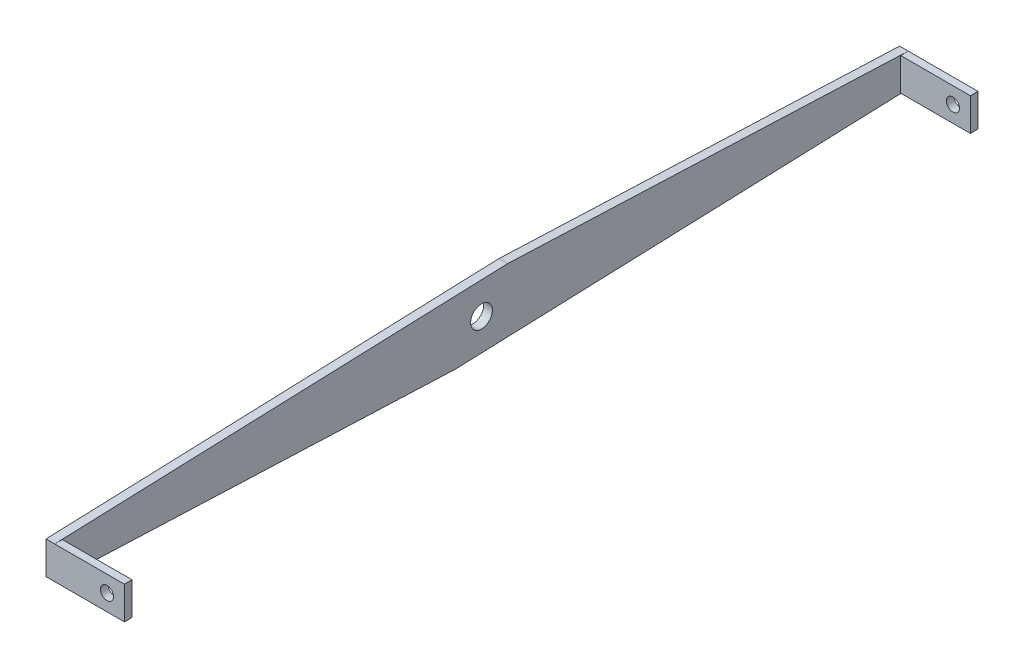
ISO-10303-21;
HEADER;
FILE_DESCRIPTION(('STEP AP214'),'2;1');
FILE_NAME('part.step','',(''),(''),'','','');
FILE_SCHEMA(('AUTOMOTIVE_DESIGN { 1 0 10303 214 1 1 1 1 }'));
ENDSEC;
DATA;
#1=APPLICATION_CONTEXT('core data for automotive mechanical design processes');
#2=APPLICATION_PROTOCOL_DEFINITION('international standard','automotive_design',2000,#1);
#3=PRODUCT_CONTEXT('',#1,'mechanical');
#4=PRODUCT('Part','Part','',(#3));
#5=PRODUCT_RELATED_PRODUCT_CATEGORY('part','',(#4));
#6=PRODUCT_DEFINITION_FORMATION('','',#4);
#7=PRODUCT_DEFINITION_CONTEXT('part definition',#1,'design');
#8=PRODUCT_DEFINITION('design','',#6,#7);
#9=PRODUCT_DEFINITION_SHAPE('','',#8);
#10=(LENGTH_UNIT() NAMED_UNIT(*) SI_UNIT(.MILLI.,.METRE.));
#11=(NAMED_UNIT(*) PLANE_ANGLE_UNIT() SI_UNIT($,.RADIAN.));
#12=(NAMED_UNIT(*) SI_UNIT($,.STERADIAN.) SOLID_ANGLE_UNIT());
#13=UNCERTAINTY_MEASURE_WITH_UNIT(LENGTH_MEASURE(1.E-05),#10,'distance_accuracy_value','');
#14=(GEOMETRIC_REPRESENTATION_CONTEXT(3) GLOBAL_UNCERTAINTY_ASSIGNED_CONTEXT((#13)) GLOBAL_UNIT_ASSIGNED_CONTEXT((#10,
#11,#12)) REPRESENTATION_CONTEXT('',''));
#15=CARTESIAN_POINT('',(0.,0.,0.));
#16=DIRECTION('',(0.,0.,1.));
#17=DIRECTION('',(1.,0.,0.));
#18=AXIS2_PLACEMENT_3D('',#15,#16,#17);
#19=CARTESIAN_POINT('',(2.,0.,0.));
#20=DIRECTION('',(1.,0.,0.));
#21=DIRECTION('',(0.,0.,-1.));
#22=AXIS2_PLACEMENT_3D('',#19,#20,#21);
#23=PLANE('',#22);
#24=CARTESIAN_POINT('',(2.,-7.5,-196.));
#25=DIRECTION('',(1.,0.,0.));
#26=DIRECTION('',(0.,0.,-1.));
#27=AXIS2_PLACEMENT_3D('',#24,#25,#26);
#28=CIRCLE('',#27,4.99999999999999);
#29=CARTESIAN_POINT('',(2.,-7.5,-201.));
#30=VERTEX_POINT('',#29);
#31=EDGE_CURVE('E253',#30,#30,#28,.T.);
#32=ORIENTED_EDGE('',*,*,#31,.F.);
#33=EDGE_LOOP('',(#32));
#34=FACE_BOUND('',#33,.T.);
#35=DIRECTION('',(0.,-1.,0.));
#36=VECTOR('',#35,1.);
#37=CARTESIAN_POINT('',(2.,-15.,-388.5));
#38=LINE('',#37,#36);
#39=CARTESIAN_POINT('',(2.,0.,-388.5));
#40=VERTEX_POINT('',#39);
#41=CARTESIAN_POINT('',(2.,-15.,-388.5));
#42=VERTEX_POINT('',#41);
#43=EDGE_CURVE('E237',#40,#42,#38,.T.);
#44=ORIENTED_EDGE('',*,*,#43,.F.);
#45=DIRECTION('',(0.,0.,1.));
#46=VECTOR('',#45,1.);
#47=CARTESIAN_POINT('',(2.,0.,-392.));
#48=LINE('',#47,#46);
#49=CARTESIAN_POINT('',(2.,0.,-392.));
#50=VERTEX_POINT('',#49);
#51=EDGE_CURVE('E235',#50,#40,#48,.T.);
#52=ORIENTED_EDGE('',*,*,#51,.F.);
#53=DIRECTION('',(0.,0.0407270506581183,0.999170309479165));
#54=VECTOR('',#53,1.);
#55=CARTESIAN_POINT('',(2.,7.50000000000003,-208.));
#56=LINE('',#55,#54);
#57=CARTESIAN_POINT('',(2.,7.50000000000003,-208.));
#58=VERTEX_POINT('',#57);
#59=EDGE_CURVE('E189',#50,#58,#56,.T.);
#60=ORIENTED_EDGE('',*,*,#59,.T.);
#61=DIRECTION('',(0.,-0.0360342748063684,0.999350554629945));
#62=VECTOR('',#61,1.);
#63=CARTESIAN_POINT('',(2.,0.,0.));
#64=LINE('',#63,#62);
#65=CARTESIAN_POINT('',(2.,0.,0.));
#66=VERTEX_POINT('',#65);
#67=EDGE_CURVE('E191',#58,#66,#64,.T.);
#68=ORIENTED_EDGE('',*,*,#67,.T.);
#69=DIRECTION('',(0.,0.,1.));
#70=VECTOR('',#69,1.);
#71=CARTESIAN_POINT('',(2.,0.,0.));
#72=LINE('',#71,#70);
#73=CARTESIAN_POINT('',(2.,0.,-3.5));
#74=VERTEX_POINT('',#73);
#75=EDGE_CURVE('E59',#74,#66,#72,.T.);
#76=ORIENTED_EDGE('',*,*,#75,.F.);
#77=DIRECTION('',(0.,1.,0.));
#78=VECTOR('',#77,1.);
#79=CARTESIAN_POINT('',(2.,0.,-3.5));
#80=LINE('',#79,#78);
#81=CARTESIAN_POINT('',(2.,-15.,-3.5));
#82=VERTEX_POINT('',#81);
#83=EDGE_CURVE('E154',#82,#74,#80,.T.);
#84=ORIENTED_EDGE('',*,*,#83,.F.);
#85=DIRECTION('',(0.,0.,-1.));
#86=VECTOR('',#85,1.);
#87=CARTESIAN_POINT('',(2.,-15.,0.));
#88=LINE('',#87,#86);
#89=CARTESIAN_POINT('',(2.,-15.,0.));
#90=VERTEX_POINT('',#89);
#91=EDGE_CURVE('E151',#90,#82,#88,.T.);
#92=ORIENTED_EDGE('',*,*,#91,.F.);
#93=DIRECTION('',(0.,-0.0407270506581183,-0.999170309479165));
#94=VECTOR('',#93,1.);
#95=CARTESIAN_POINT('',(2.,-15.,0.));
#96=LINE('',#95,#94);
#97=CARTESIAN_POINT('',(2.,-22.5,-184.));
#98=VERTEX_POINT('',#97);
#99=EDGE_CURVE('E183',#90,#98,#96,.T.);
#100=ORIENTED_EDGE('',*,*,#99,.T.);
#101=DIRECTION('',(0.,0.0360342748063683,-0.999350554629945));
#102=VECTOR('',#101,1.);
#103=CARTESIAN_POINT('',(2.,-22.5,-184.));
#104=LINE('',#103,#102);
#105=CARTESIAN_POINT('',(2.,-15.,-392.));
#106=VERTEX_POINT('',#105);
#107=EDGE_CURVE('E185',#98,#106,#104,.T.);
#108=ORIENTED_EDGE('',*,*,#107,.T.);
#109=DIRECTION('',(0.,0.,-1.));
#110=VECTOR('',#109,1.);
#111=CARTESIAN_POINT('',(2.,-15.,-392.));
#112=LINE('',#111,#110);
#113=EDGE_CURVE('E144',#42,#106,#112,.T.);
#114=ORIENTED_EDGE('',*,*,#113,.F.);
#115=EDGE_LOOP('',(#44,#52,#60,#68,#76,#84,#92,#100,#108,#114));
#116=FACE_BOUND('',#115,.T.);
#117=ADVANCED_FACE('F35',(#34,#116),#23,.T.);
#118=CARTESIAN_POINT('',(2.,0.,0.));
#119=DIRECTION('',(0.,0.,-1.));
#120=DIRECTION('',(-1.,0.,0.));
#121=AXIS2_PLACEMENT_3D('',#118,#119,#120);
#122=PLANE('',#121);
#123=CARTESIAN_POINT('',(26.0000000000002,-7.5,0.));
#124=DIRECTION('',(0.,0.,1.));
#125=DIRECTION('',(1.,0.,0.));
#126=AXIS2_PLACEMENT_3D('',#123,#124,#125);
#127=CIRCLE('',#126,3.00000000000001);
#128=CARTESIAN_POINT('',(29.0000000000002,-7.5,0.));
#129=VERTEX_POINT('',#128);
#130=EDGE_CURVE('E249',#129,#129,#127,.T.);
#131=ORIENTED_EDGE('',*,*,#130,.F.);
#132=EDGE_LOOP('',(#131));
#133=FACE_BOUND('',#132,.T.);
#134=DIRECTION('',(0.,-1.,0.));
#135=VECTOR('',#134,1.);
#136=CARTESIAN_POINT('',(-2.,0.,0.));
#137=LINE('',#136,#135);
#138=CARTESIAN_POINT('',(-2.,0.,0.));
#139=VERTEX_POINT('',#138);
#140=CARTESIAN_POINT('',(-2.,-15.,0.));
#141=VERTEX_POINT('',#140);
#142=EDGE_CURVE('E182',#139,#141,#137,.T.);
#143=ORIENTED_EDGE('',*,*,#142,.T.);
#144=DIRECTION('',(-1.,0.,0.));
#145=VECTOR('',#144,1.);
#146=CARTESIAN_POINT('',(2.,-15.,0.));
#147=LINE('',#146,#145);
#148=EDGE_CURVE('E11',#90,#141,#147,.T.);
#149=ORIENTED_EDGE('',*,*,#148,.F.);
#150=DIRECTION('',(-1.,0.,0.));
#151=VECTOR('',#150,1.);
#152=CARTESIAN_POINT('',(34.,-15.,0.));
#153=LINE('',#152,#151);
#154=CARTESIAN_POINT('',(34.,-15.,0.));
#155=VERTEX_POINT('',#154);
#156=EDGE_CURVE('E179',#155,#90,#153,.T.);
#157=ORIENTED_EDGE('',*,*,#156,.F.);
#158=DIRECTION('',(0.,-1.,0.));
#159=VECTOR('',#158,1.);
#160=CARTESIAN_POINT('',(34.,0.,0.));
#161=LINE('',#160,#159);
#162=CARTESIAN_POINT('',(34.,0.,0.));
#163=VERTEX_POINT('',#162);
#164=EDGE_CURVE('E159',#163,#155,#161,.T.);
#165=ORIENTED_EDGE('',*,*,#164,.F.);
#166=DIRECTION('',(-1.,0.,0.));
#167=VECTOR('',#166,1.);
#168=CARTESIAN_POINT('',(34.,0.,0.));
#169=LINE('',#168,#167);
#170=EDGE_CURVE('E167',#163,#66,#169,.T.);
#171=ORIENTED_EDGE('',*,*,#170,.T.);
#172=DIRECTION('',(-1.,0.,0.));
#173=VECTOR('',#172,1.);
#174=CARTESIAN_POINT('',(2.,0.,0.));
#175=LINE('',#174,#173);
#176=EDGE_CURVE('E193',#66,#139,#175,.T.);
#177=ORIENTED_EDGE('',*,*,#176,.T.);
#178=EDGE_LOOP('',(#143,#149,#157,#165,#171,#177));
#179=FACE_BOUND('',#178,.T.);
#180=ADVANCED_FACE('F37',(#133,#179),#122,.F.);
#181=CARTESIAN_POINT('',(2.,-15.,0.));
#182=DIRECTION('',(0.,0.999170309479165,-0.0407270506581183));
#183=DIRECTION('',(0.,0.0407270506581183,0.999170309479166));
#184=AXIS2_PLACEMENT_3D('',#181,#182,#183);
#185=PLANE('',#184);
#186=DIRECTION('',(0.,-0.0407270506581183,-0.999170309479165));
#187=VECTOR('',#186,1.);
#188=CARTESIAN_POINT('',(-2.,-15.,0.));
#189=LINE('',#188,#187);
#190=CARTESIAN_POINT('',(-2.,-22.5,-184.));
#191=VERTEX_POINT('',#190);
#192=EDGE_CURVE('E196',#141,#191,#189,.T.);
#193=ORIENTED_EDGE('',*,*,#192,.T.);
#194=DIRECTION('',(-1.,0.,0.));
#195=VECTOR('',#194,1.);
#196=CARTESIAN_POINT('',(2.,-22.5,-184.));
#197=LINE('',#196,#195);
#198=EDGE_CURVE('E44',#98,#191,#197,.T.);
#199=ORIENTED_EDGE('',*,*,#198,.F.);
#200=ORIENTED_EDGE('',*,*,#99,.F.);
#201=ORIENTED_EDGE('',*,*,#148,.T.);
#202=EDGE_LOOP('',(#193,#199,#200,#201));
#203=FACE_BOUND('',#202,.T.);
#204=ADVANCED_FACE('F283',(#203),#185,.F.);
#205=CARTESIAN_POINT('',(2.,-22.5,-184.));
#206=DIRECTION('',(0.,0.999350554629945,0.0360342748063683));
#207=DIRECTION('',(0.,-0.0360342748063683,0.999350554629945));
#208=AXIS2_PLACEMENT_3D('',#205,#206,#207);
#209=PLANE('',#208);
#210=DIRECTION('',(0.,0.0360342748063683,-0.999350554629945));
#211=VECTOR('',#210,1.);
#212=CARTESIAN_POINT('',(-2.,-22.5,-184.));
#213=LINE('',#212,#211);
#214=CARTESIAN_POINT('',(-2.,-15.,-392.));
#215=VERTEX_POINT('',#214);
#216=EDGE_CURVE('E198',#191,#215,#213,.T.);
#217=ORIENTED_EDGE('',*,*,#216,.T.);
#218=DIRECTION('',(-1.,0.,0.));
#219=VECTOR('',#218,1.);
#220=CARTESIAN_POINT('',(2.,-15.,-392.));
#221=LINE('',#220,#219);
#222=EDGE_CURVE('E211',#106,#215,#221,.T.);
#223=ORIENTED_EDGE('',*,*,#222,.F.);
#224=ORIENTED_EDGE('',*,*,#107,.F.);
#225=ORIENTED_EDGE('',*,*,#198,.T.);
#226=EDGE_LOOP('',(#217,#223,#224,#225));
#227=FACE_BOUND('',#226,.T.);
#228=ADVANCED_FACE('F219',(#227),#209,.F.);
#229=CARTESIAN_POINT('',(2.,0.,-392.));
#230=DIRECTION('',(0.,0.,1.));
#231=DIRECTION('',(1.,0.,0.));
#232=AXIS2_PLACEMENT_3D('',#229,#230,#231);
#233=PLANE('',#232);
#234=CARTESIAN_POINT('',(26.0000000000002,-7.5,-392.));
#235=DIRECTION('',(0.,0.,1.));
#236=DIRECTION('',(1.,0.,0.));
#237=AXIS2_PLACEMENT_3D('',#234,#235,#236);
#238=CIRCLE('',#237,3.00000000000001);
#239=CARTESIAN_POINT('',(29.0000000000002,-7.5,-392.));
#240=VERTEX_POINT('',#239);
#241=EDGE_CURVE('E252',#240,#240,#238,.T.);
#242=ORIENTED_EDGE('',*,*,#241,.T.);
#243=EDGE_LOOP('',(#242));
#244=FACE_BOUND('',#243,.T.);
#245=DIRECTION('',(0.,1.,0.));
#246=VECTOR('',#245,1.);
#247=CARTESIAN_POINT('',(-2.,0.,-392.));
#248=LINE('',#247,#246);
#249=CARTESIAN_POINT('',(-2.,0.,-392.));
#250=VERTEX_POINT('',#249);
#251=EDGE_CURVE('E200',#215,#250,#248,.T.);
#252=ORIENTED_EDGE('',*,*,#251,.T.);
#253=DIRECTION('',(-1.,0.,0.));
#254=VECTOR('',#253,1.);
#255=CARTESIAN_POINT('',(2.,0.,-392.));
#256=LINE('',#255,#254);
#257=EDGE_CURVE('E149',#50,#250,#256,.T.);
#258=ORIENTED_EDGE('',*,*,#257,.F.);
#259=DIRECTION('',(-1.,0.,0.));
#260=VECTOR('',#259,1.);
#261=CARTESIAN_POINT('',(34.,0.,-392.));
#262=LINE('',#261,#260);
#263=CARTESIAN_POINT('',(34.,0.,-392.));
#264=VERTEX_POINT('',#263);
#265=EDGE_CURVE('E129',#264,#50,#262,.T.);
#266=ORIENTED_EDGE('',*,*,#265,.F.);
#267=DIRECTION('',(0.,1.,0.));
#268=VECTOR('',#267,1.);
#269=CARTESIAN_POINT('',(34.,-15.,-392.));
#270=LINE('',#269,#268);
#271=CARTESIAN_POINT('',(34.,-15.,-392.));
#272=VERTEX_POINT('',#271);
#273=EDGE_CURVE('E136',#272,#264,#270,.T.);
#274=ORIENTED_EDGE('',*,*,#273,.F.);
#275=DIRECTION('',(-1.,0.,0.));
#276=VECTOR('',#275,1.);
#277=CARTESIAN_POINT('',(34.,-15.,-392.));
#278=LINE('',#277,#276);
#279=EDGE_CURVE('E247',#272,#106,#278,.T.);
#280=ORIENTED_EDGE('',*,*,#279,.T.);
#281=ORIENTED_EDGE('',*,*,#222,.T.);
#282=EDGE_LOOP('',(#252,#258,#266,#274,#280,#281));
#283=FACE_BOUND('',#282,.T.);
#284=ADVANCED_FACE('F147',(#244,#283),#233,.F.);
#285=CARTESIAN_POINT('',(2.,7.50000000000003,-208.));
#286=DIRECTION('',(0.,-0.999170309479165,0.0407270506581183));
#287=DIRECTION('',(0.,-0.0407270506581183,-0.999170309479166));
#288=AXIS2_PLACEMENT_3D('',#285,#286,#287);
#289=PLANE('',#288);
#290=DIRECTION('',(0.,0.0407270506581183,0.999170309479165));
#291=VECTOR('',#290,1.);
#292=CARTESIAN_POINT('',(-2.,7.50000000000003,-208.));
#293=LINE('',#292,#291);
#294=CARTESIAN_POINT('',(-2.,7.50000000000003,-208.));
#295=VERTEX_POINT('',#294);
#296=EDGE_CURVE('E202',#250,#295,#293,.T.);
#297=ORIENTED_EDGE('',*,*,#296,.T.);
#298=DIRECTION('',(-1.,0.,0.));
#299=VECTOR('',#298,1.);
#300=CARTESIAN_POINT('',(2.,7.50000000000003,-208.));
#301=LINE('',#300,#299);
#302=EDGE_CURVE('E207',#58,#295,#301,.T.);
#303=ORIENTED_EDGE('',*,*,#302,.F.);
#304=ORIENTED_EDGE('',*,*,#59,.F.);
#305=ORIENTED_EDGE('',*,*,#257,.T.);
#306=EDGE_LOOP('',(#297,#303,#304,#305));
#307=FACE_BOUND('',#306,.T.);
#308=ADVANCED_FACE('F230',(#307),#289,.F.);
#309=CARTESIAN_POINT('',(2.,0.,0.));
#310=DIRECTION('',(0.,-0.999350554629945,-0.0360342748063684));
#311=DIRECTION('',(0.,0.0360342748063684,-0.999350554629945));
#312=AXIS2_PLACEMENT_3D('',#309,#310,#311);
#313=PLANE('',#312);
#314=DIRECTION('',(0.,-0.0360342748063684,0.999350554629945));
#315=VECTOR('',#314,1.);
#316=CARTESIAN_POINT('',(-2.,0.,0.));
#317=LINE('',#316,#315);
#318=EDGE_CURVE('E186',#295,#139,#317,.T.);
#319=ORIENTED_EDGE('',*,*,#318,.T.);
#320=ORIENTED_EDGE('',*,*,#176,.F.);
#321=ORIENTED_EDGE('',*,*,#67,.F.);
#322=ORIENTED_EDGE('',*,*,#302,.T.);
#323=EDGE_LOOP('',(#319,#320,#321,#322));
#324=FACE_BOUND('',#323,.T.);
#325=ADVANCED_FACE('F266',(#324),#313,.F.);
#326=CARTESIAN_POINT('',(-2.,0.,0.));
#327=DIRECTION('',(1.,0.,0.));
#328=DIRECTION('',(0.,0.,-1.));
#329=AXIS2_PLACEMENT_3D('',#326,#327,#328);
#330=PLANE('',#329);
#331=CARTESIAN_POINT('',(-2.,-7.5,-196.));
#332=DIRECTION('',(-1.,0.,0.));
#333=DIRECTION('',(0.,0.,1.));
#334=AXIS2_PLACEMENT_3D('',#331,#332,#333);
#335=CIRCLE('',#334,4.99999999999999);
#336=CARTESIAN_POINT('',(-2.,-7.5,-191.));
#337=VERTEX_POINT('',#336);
#338=EDGE_CURVE('E258',#337,#337,#335,.T.);
#339=ORIENTED_EDGE('',*,*,#338,.F.);
#340=EDGE_LOOP('',(#339));
#341=FACE_BOUND('',#340,.T.);
#342=ORIENTED_EDGE('',*,*,#142,.F.);
#343=ORIENTED_EDGE('',*,*,#318,.F.);
#344=ORIENTED_EDGE('',*,*,#296,.F.);
#345=ORIENTED_EDGE('',*,*,#251,.F.);
#346=ORIENTED_EDGE('',*,*,#216,.F.);
#347=ORIENTED_EDGE('',*,*,#192,.F.);
#348=EDGE_LOOP('',(#342,#343,#344,#345,#346,#347));
#349=FACE_BOUND('',#348,.T.);
#350=ADVANCED_FACE('F226',(#341,#349),#330,.F.);
#351=CARTESIAN_POINT('',(34.,-15.,0.));
#352=DIRECTION('',(0.,1.,0.));
#353=DIRECTION('',(0.,0.,1.));
#354=AXIS2_PLACEMENT_3D('',#351,#352,#353);
#355=PLANE('',#354);
#356=ORIENTED_EDGE('',*,*,#91,.T.);
#357=DIRECTION('',(-1.,0.,0.));
#358=VECTOR('',#357,1.);
#359=CARTESIAN_POINT('',(34.,-15.,-3.5));
#360=LINE('',#359,#358);
#361=CARTESIAN_POINT('',(34.,-15.,-3.5));
#362=VERTEX_POINT('',#361);
#363=EDGE_CURVE('E176',#362,#82,#360,.T.);
#364=ORIENTED_EDGE('',*,*,#363,.F.);
#365=DIRECTION('',(0.,0.,-1.));
#366=VECTOR('',#365,1.);
#367=CARTESIAN_POINT('',(34.,-15.,0.));
#368=LINE('',#367,#366);
#369=EDGE_CURVE('E162',#155,#362,#368,.T.);
#370=ORIENTED_EDGE('',*,*,#369,.F.);
#371=ORIENTED_EDGE('',*,*,#156,.T.);
#372=EDGE_LOOP('',(#356,#364,#370,#371));
#373=FACE_BOUND('',#372,.T.);
#374=ADVANCED_FACE('F265',(#373),#355,.F.);
#375=CARTESIAN_POINT('',(34.,0.,-3.5));
#376=DIRECTION('',(0.,0.,1.));
#377=DIRECTION('',(0.,-1.,0.));
#378=AXIS2_PLACEMENT_3D('',#375,#376,#377);
#379=PLANE('',#378);
#380=CARTESIAN_POINT('',(26.0000000000002,-7.5,-3.5));
#381=DIRECTION('',(0.,0.,1.));
#382=DIRECTION('',(0.,-1.,0.));
#383=AXIS2_PLACEMENT_3D('',#380,#381,#382);
#384=CIRCLE('',#383,3.00000000000001);
#385=CARTESIAN_POINT('',(26.0000000000002,-10.5,-3.5));
#386=VERTEX_POINT('',#385);
#387=EDGE_CURVE('E238',#386,#386,#384,.T.);
#388=ORIENTED_EDGE('',*,*,#387,.T.);
#389=EDGE_LOOP('',(#388));
#390=FACE_BOUND('',#389,.T.);
#391=ORIENTED_EDGE('',*,*,#83,.T.);
#392=DIRECTION('',(-1.,0.,0.));
#393=VECTOR('',#392,1.);
#394=CARTESIAN_POINT('',(34.,0.,-3.5));
#395=LINE('',#394,#393);
#396=CARTESIAN_POINT('',(34.,0.,-3.5));
#397=VERTEX_POINT('',#396);
#398=EDGE_CURVE('E173',#397,#74,#395,.T.);
#399=ORIENTED_EDGE('',*,*,#398,.F.);
#400=DIRECTION('',(0.,1.,0.));
#401=VECTOR('',#400,1.);
#402=CARTESIAN_POINT('',(34.,0.,-3.5));
#403=LINE('',#402,#401);
#404=EDGE_CURVE('E164',#362,#397,#403,.T.);
#405=ORIENTED_EDGE('',*,*,#404,.F.);
#406=ORIENTED_EDGE('',*,*,#363,.T.);
#407=EDGE_LOOP('',(#391,#399,#405,#406));
#408=FACE_BOUND('',#407,.T.);
#409=ADVANCED_FACE('F272',(#390,#408),#379,.F.);
#410=CARTESIAN_POINT('',(34.,0.,0.));
#411=DIRECTION('',(0.,-1.,0.));
#412=DIRECTION('',(0.,0.,-1.));
#413=AXIS2_PLACEMENT_3D('',#410,#411,#412);
#414=PLANE('',#413);
#415=ORIENTED_EDGE('',*,*,#75,.T.);
#416=ORIENTED_EDGE('',*,*,#170,.F.);
#417=DIRECTION('',(0.,0.,1.));
#418=VECTOR('',#417,1.);
#419=CARTESIAN_POINT('',(34.,0.,0.));
#420=LINE('',#419,#418);
#421=EDGE_CURVE('E166',#397,#163,#420,.T.);
#422=ORIENTED_EDGE('',*,*,#421,.F.);
#423=ORIENTED_EDGE('',*,*,#398,.T.);
#424=EDGE_LOOP('',(#415,#416,#422,#423));
#425=FACE_BOUND('',#424,.T.);
#426=ADVANCED_FACE('F289',(#425),#414,.F.);
#427=CARTESIAN_POINT('',(34.,0.,0.));
#428=DIRECTION('',(1.,0.,0.));
#429=DIRECTION('',(0.,0.,-1.));
#430=AXIS2_PLACEMENT_3D('',#427,#428,#429);
#431=PLANE('',#430);
#432=ORIENTED_EDGE('',*,*,#164,.T.);
#433=ORIENTED_EDGE('',*,*,#369,.T.);
#434=ORIENTED_EDGE('',*,*,#404,.T.);
#435=ORIENTED_EDGE('',*,*,#421,.T.);
#436=EDGE_LOOP('',(#432,#433,#434,#435));
#437=FACE_BOUND('',#436,.T.);
#438=ADVANCED_FACE('F293',(#437),#431,.T.);
#439=CARTESIAN_POINT('',(34.,0.,-392.));
#440=DIRECTION('',(0.,-1.,0.));
#441=DIRECTION('',(0.,0.,-1.));
#442=AXIS2_PLACEMENT_3D('',#439,#440,#441);
#443=PLANE('',#442);
#444=ORIENTED_EDGE('',*,*,#51,.T.);
#445=DIRECTION('',(-1.,0.,0.));
#446=VECTOR('',#445,1.);
#447=CARTESIAN_POINT('',(34.,0.,-388.5));
#448=LINE('',#447,#446);
#449=CARTESIAN_POINT('',(34.,0.,-388.5));
#450=VERTEX_POINT('',#449);
#451=EDGE_CURVE('E132',#450,#40,#448,.T.);
#452=ORIENTED_EDGE('',*,*,#451,.F.);
#453=DIRECTION('',(0.,0.,1.));
#454=VECTOR('',#453,1.);
#455=CARTESIAN_POINT('',(34.,0.,-392.));
#456=LINE('',#455,#454);
#457=EDGE_CURVE('E125',#264,#450,#456,.T.);
#458=ORIENTED_EDGE('',*,*,#457,.F.);
#459=ORIENTED_EDGE('',*,*,#265,.T.);
#460=EDGE_LOOP('',(#444,#452,#458,#459));
#461=FACE_BOUND('',#460,.T.);
#462=ADVANCED_FACE('F127',(#461),#443,.F.);
#463=CARTESIAN_POINT('',(34.,-15.,-388.5));
#464=DIRECTION('',(0.,0.,-1.));
#465=DIRECTION('',(-1.,0.,0.));
#466=AXIS2_PLACEMENT_3D('',#463,#464,#465);
#467=PLANE('',#466);
#468=CARTESIAN_POINT('',(26.0000000000002,-7.5,-388.5));
#469=DIRECTION('',(0.,0.,-1.));
#470=DIRECTION('',(-1.,0.,0.));
#471=AXIS2_PLACEMENT_3D('',#468,#469,#470);
#472=CIRCLE('',#471,3.00000000000001);
#473=CARTESIAN_POINT('',(23.0000000000002,-7.5,-388.5));
#474=VERTEX_POINT('',#473);
#475=EDGE_CURVE('E39',#474,#474,#472,.T.);
#476=ORIENTED_EDGE('',*,*,#475,.T.);
#477=EDGE_LOOP('',(#476));
#478=FACE_BOUND('',#477,.T.);
#479=ORIENTED_EDGE('',*,*,#43,.T.);
#480=DIRECTION('',(-1.,0.,0.));
#481=VECTOR('',#480,1.);
#482=CARTESIAN_POINT('',(34.,-15.,-388.5));
#483=LINE('',#482,#481);
#484=CARTESIAN_POINT('',(34.,-15.,-388.5));
#485=VERTEX_POINT('',#484);
#486=EDGE_CURVE('E51',#485,#42,#483,.T.);
#487=ORIENTED_EDGE('',*,*,#486,.F.);
#488=DIRECTION('',(0.,-1.,0.));
#489=VECTOR('',#488,1.);
#490=CARTESIAN_POINT('',(34.,-15.,-388.5));
#491=LINE('',#490,#489);
#492=EDGE_CURVE('E135',#450,#485,#491,.T.);
#493=ORIENTED_EDGE('',*,*,#492,.F.);
#494=ORIENTED_EDGE('',*,*,#451,.T.);
#495=EDGE_LOOP('',(#479,#487,#493,#494));
#496=FACE_BOUND('',#495,.T.);
#497=ADVANCED_FACE('F300',(#478,#496),#467,.F.);
#498=CARTESIAN_POINT('',(34.,-15.,-392.));
#499=DIRECTION('',(0.,1.,0.));
#500=DIRECTION('',(0.,0.,1.));
#501=AXIS2_PLACEMENT_3D('',#498,#499,#500);
#502=PLANE('',#501);
#503=ORIENTED_EDGE('',*,*,#113,.T.);
#504=ORIENTED_EDGE('',*,*,#279,.F.);
#505=DIRECTION('',(0.,0.,-1.));
#506=VECTOR('',#505,1.);
#507=CARTESIAN_POINT('',(34.,-15.,-392.));
#508=LINE('',#507,#506);
#509=EDGE_CURVE('E140',#485,#272,#508,.T.);
#510=ORIENTED_EDGE('',*,*,#509,.F.);
#511=ORIENTED_EDGE('',*,*,#486,.T.);
#512=EDGE_LOOP('',(#503,#504,#510,#511));
#513=FACE_BOUND('',#512,.T.);
#514=ADVANCED_FACE('F303',(#513),#502,.F.);
#515=CARTESIAN_POINT('',(34.,0.,0.));
#516=DIRECTION('',(1.,0.,0.));
#517=DIRECTION('',(0.,0.,-1.));
#518=AXIS2_PLACEMENT_3D('',#515,#516,#517);
#519=PLANE('',#518);
#520=ORIENTED_EDGE('',*,*,#273,.T.);
#521=ORIENTED_EDGE('',*,*,#457,.T.);
#522=ORIENTED_EDGE('',*,*,#492,.T.);
#523=ORIENTED_EDGE('',*,*,#509,.T.);
#524=EDGE_LOOP('',(#520,#521,#522,#523));
#525=FACE_BOUND('',#524,.T.);
#526=ADVANCED_FACE('F139',(#525),#519,.T.);
#527=CARTESIAN_POINT('',(26.0000000000002,-7.5,-392.));
#528=DIRECTION('',(0.,0.,1.));
#529=DIRECTION('',(1.,0.,0.));
#530=AXIS2_PLACEMENT_3D('',#527,#528,#529);
#531=CYLINDRICAL_SURFACE('',#530,3.00000000000001);
#532=ORIENTED_EDGE('',*,*,#241,.F.);
#533=EDGE_LOOP('',(#532));
#534=FACE_BOUND('',#533,.T.);
#535=ORIENTED_EDGE('',*,*,#475,.F.);
#536=EDGE_LOOP('',(#535));
#537=FACE_BOUND('',#536,.T.);
#538=ADVANCED_FACE('F309',(#534,#537),#531,.F.);
#539=ORIENTED_EDGE('',*,*,#130,.T.);
#540=EDGE_LOOP('',(#539));
#541=FACE_BOUND('',#540,.T.);
#542=ORIENTED_EDGE('',*,*,#387,.F.);
#543=EDGE_LOOP('',(#542));
#544=FACE_BOUND('',#543,.T.);
#545=ADVANCED_FACE('F310',(#541,#544),#531,.F.);
#546=CARTESIAN_POINT('',(3.,-7.5,-196.));
#547=DIRECTION('',(-1.,0.,0.));
#548=DIRECTION('',(0.,0.,1.));
#549=AXIS2_PLACEMENT_3D('',#546,#547,#548);
#550=CYLINDRICAL_SURFACE('',#549,4.99999999999999);
#551=ORIENTED_EDGE('',*,*,#31,.T.);
#552=EDGE_LOOP('',(#551));
#553=FACE_BOUND('',#552,.T.);
#554=ORIENTED_EDGE('',*,*,#338,.T.);
#555=EDGE_LOOP('',(#554));
#556=FACE_BOUND('',#555,.T.);
#557=ADVANCED_FACE('F262',(#553,#556),#550,.F.);
#558=CLOSED_SHELL('',(#117,#180,#204,#228,#284,#308,#325,#350,#374,#409,#426,#438,#462,#497,
#514,#526,#538,#545,#557));
#559=MANIFOLD_SOLID_BREP('B2',#558);
#560=ADVANCED_BREP_SHAPE_REPRESENTATION('',(#18,#559),#14);
#561=SHAPE_DEFINITION_REPRESENTATION(#9,#560);
ENDSEC;
END-ISO-10303-21;
